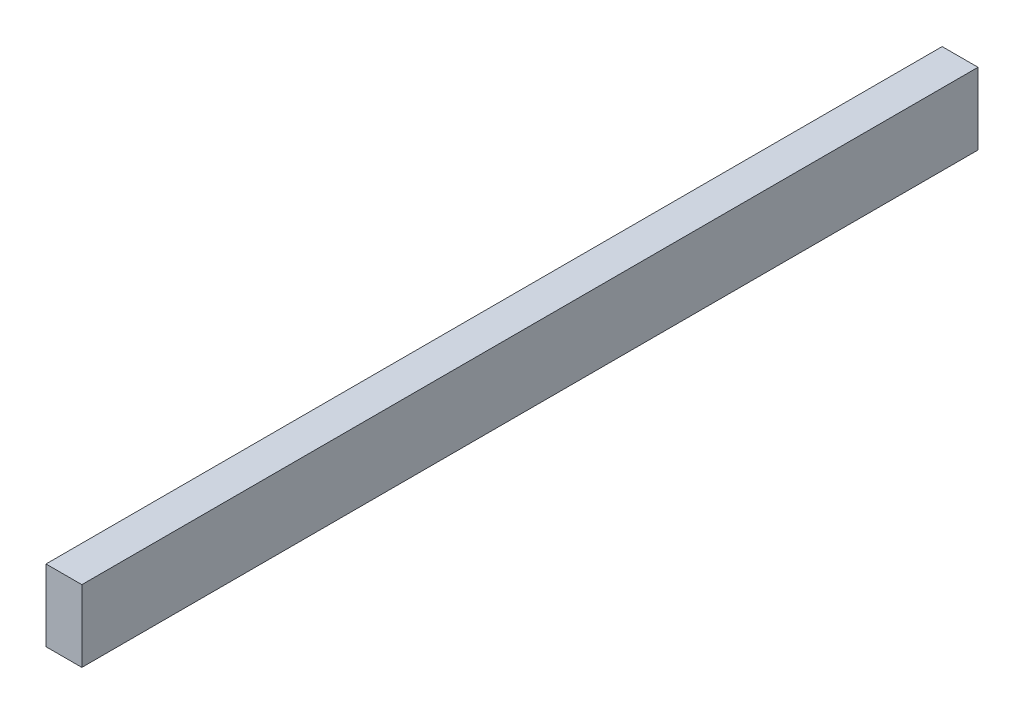
ISO-10303-21;
HEADER;
FILE_DESCRIPTION(('STEP AP214'),'2;1');
FILE_NAME('part.step','',(''),(''),'','','');
FILE_SCHEMA(('AUTOMOTIVE_DESIGN { 1 0 10303 214 1 1 1 1 }'));
ENDSEC;
DATA;
#1=APPLICATION_CONTEXT('core data for automotive mechanical design processes');
#2=APPLICATION_PROTOCOL_DEFINITION('international standard','automotive_design',2000,#1);
#3=PRODUCT_CONTEXT('',#1,'mechanical');
#4=PRODUCT('Part','Part','',(#3));
#5=PRODUCT_RELATED_PRODUCT_CATEGORY('part','',(#4));
#6=PRODUCT_DEFINITION_FORMATION('','',#4);
#7=PRODUCT_DEFINITION_CONTEXT('part definition',#1,'design');
#8=PRODUCT_DEFINITION('design','',#6,#7);
#9=PRODUCT_DEFINITION_SHAPE('','',#8);
#10=(LENGTH_UNIT() NAMED_UNIT(*) SI_UNIT(.MILLI.,.METRE.));
#11=(NAMED_UNIT(*) PLANE_ANGLE_UNIT() SI_UNIT($,.RADIAN.));
#12=(NAMED_UNIT(*) SI_UNIT($,.STERADIAN.) SOLID_ANGLE_UNIT());
#13=UNCERTAINTY_MEASURE_WITH_UNIT(LENGTH_MEASURE(1.E-05),#10,'distance_accuracy_value','');
#14=(GEOMETRIC_REPRESENTATION_CONTEXT(3) GLOBAL_UNCERTAINTY_ASSIGNED_CONTEXT((#13)) GLOBAL_UNIT_ASSIGNED_CONTEXT((#10,
#11,#12)) REPRESENTATION_CONTEXT('',''));
#15=CARTESIAN_POINT('',(0.,0.,0.));
#16=DIRECTION('',(0.,0.,1.));
#17=DIRECTION('',(1.,0.,0.));
#18=AXIS2_PLACEMENT_3D('',#15,#16,#17);
#19=CARTESIAN_POINT('',(-20.,-40.,1000.));
#20=DIRECTION('',(1.,0.,0.));
#21=DIRECTION('',(0.,0.,-1.));
#22=AXIS2_PLACEMENT_3D('',#19,#20,#21);
#23=PLANE('',#22);
#24=DIRECTION('',(0.,-1.,0.));
#25=VECTOR('',#24,1.);
#26=CARTESIAN_POINT('',(-20.,-40.,0.));
#27=LINE('',#26,#25);
#28=CARTESIAN_POINT('',(-20.,40.,0.));
#29=VERTEX_POINT('',#28);
#30=CARTESIAN_POINT('',(-20.,-40.,0.));
#31=VERTEX_POINT('',#30);
#32=EDGE_CURVE('E107',#29,#31,#27,.T.);
#33=ORIENTED_EDGE('',*,*,#32,.T.);
#34=DIRECTION('',(0.,0.,-1.));
#35=VECTOR('',#34,1.);
#36=CARTESIAN_POINT('',(-20.,-40.,1000.));
#37=LINE('',#36,#35);
#38=CARTESIAN_POINT('',(-20.,-40.,1000.));
#39=VERTEX_POINT('',#38);
#40=EDGE_CURVE('E11',#39,#31,#37,.T.);
#41=ORIENTED_EDGE('',*,*,#40,.F.);
#42=DIRECTION('',(0.,-1.,0.));
#43=VECTOR('',#42,1.);
#44=CARTESIAN_POINT('',(-20.,-40.,1000.));
#45=LINE('',#44,#43);
#46=CARTESIAN_POINT('',(-20.,40.,1000.));
#47=VERTEX_POINT('',#46);
#48=EDGE_CURVE('E91',#47,#39,#45,.T.);
#49=ORIENTED_EDGE('',*,*,#48,.F.);
#50=DIRECTION('',(0.,0.,-1.));
#51=VECTOR('',#50,1.);
#52=CARTESIAN_POINT('',(-20.,40.,1000.));
#53=LINE('',#52,#51);
#54=EDGE_CURVE('E103',#47,#29,#53,.T.);
#55=ORIENTED_EDGE('',*,*,#54,.T.);
#56=EDGE_LOOP('',(#33,#41,#49,#55));
#57=FACE_BOUND('',#56,.T.);
#58=ADVANCED_FACE('F39',(#57),#23,.F.);
#59=CARTESIAN_POINT('',(20.,-40.,1000.));
#60=DIRECTION('',(0.,1.,0.));
#61=DIRECTION('',(-1.,0.,0.));
#62=AXIS2_PLACEMENT_3D('',#59,#60,#61);
#63=PLANE('',#62);
#64=DIRECTION('',(1.,0.,0.));
#65=VECTOR('',#64,1.);
#66=CARTESIAN_POINT('',(20.,-40.,0.));
#67=LINE('',#66,#65);
#68=CARTESIAN_POINT('',(20.,-40.,0.));
#69=VERTEX_POINT('',#68);
#70=EDGE_CURVE('E96',#31,#69,#67,.T.);
#71=ORIENTED_EDGE('',*,*,#70,.T.);
#72=DIRECTION('',(0.,0.,-1.));
#73=VECTOR('',#72,1.);
#74=CARTESIAN_POINT('',(20.,-40.,1000.));
#75=LINE('',#74,#73);
#76=CARTESIAN_POINT('',(20.,-40.,1000.));
#77=VERTEX_POINT('',#76);
#78=EDGE_CURVE('E48',#77,#69,#75,.T.);
#79=ORIENTED_EDGE('',*,*,#78,.F.);
#80=DIRECTION('',(1.,0.,0.));
#81=VECTOR('',#80,1.);
#82=CARTESIAN_POINT('',(20.,-40.,1000.));
#83=LINE('',#82,#81);
#84=EDGE_CURVE('E86',#39,#77,#83,.T.);
#85=ORIENTED_EDGE('',*,*,#84,.F.);
#86=ORIENTED_EDGE('',*,*,#40,.T.);
#87=EDGE_LOOP('',(#71,#79,#85,#86));
#88=FACE_BOUND('',#87,.T.);
#89=ADVANCED_FACE('F95',(#88),#63,.F.);
#90=CARTESIAN_POINT('',(20.,-40.,1000.));
#91=DIRECTION('',(-1.,0.,0.));
#92=DIRECTION('',(0.,0.,1.));
#93=AXIS2_PLACEMENT_3D('',#90,#91,#92);
#94=PLANE('',#93);
#95=DIRECTION('',(0.,1.,0.));
#96=VECTOR('',#95,1.);
#97=CARTESIAN_POINT('',(20.,-40.,0.));
#98=LINE('',#97,#96);
#99=CARTESIAN_POINT('',(20.,40.,0.));
#100=VERTEX_POINT('',#99);
#101=EDGE_CURVE('E73',#69,#100,#98,.T.);
#102=ORIENTED_EDGE('',*,*,#101,.T.);
#103=DIRECTION('',(0.,0.,-1.));
#104=VECTOR('',#103,1.);
#105=CARTESIAN_POINT('',(20.,40.,1000.));
#106=LINE('',#105,#104);
#107=CARTESIAN_POINT('',(20.,40.,1000.));
#108=VERTEX_POINT('',#107);
#109=EDGE_CURVE('E98',#108,#100,#106,.T.);
#110=ORIENTED_EDGE('',*,*,#109,.F.);
#111=DIRECTION('',(0.,1.,0.));
#112=VECTOR('',#111,1.);
#113=CARTESIAN_POINT('',(20.,-40.,1000.));
#114=LINE('',#113,#112);
#115=EDGE_CURVE('E89',#77,#108,#114,.T.);
#116=ORIENTED_EDGE('',*,*,#115,.F.);
#117=ORIENTED_EDGE('',*,*,#78,.T.);
#118=EDGE_LOOP('',(#102,#110,#116,#117));
#119=FACE_BOUND('',#118,.T.);
#120=ADVANCED_FACE('F99',(#119),#94,.F.);
#121=CARTESIAN_POINT('',(20.,40.,1000.));
#122=DIRECTION('',(0.,-1.,0.));
#123=DIRECTION('',(0.,0.,-1.));
#124=AXIS2_PLACEMENT_3D('',#121,#122,#123);
#125=PLANE('',#124);
#126=DIRECTION('',(-1.,0.,0.));
#127=VECTOR('',#126,1.);
#128=CARTESIAN_POINT('',(20.,40.,0.));
#129=LINE('',#128,#127);
#130=EDGE_CURVE('E79',#100,#29,#129,.T.);
#131=ORIENTED_EDGE('',*,*,#130,.T.);
#132=ORIENTED_EDGE('',*,*,#54,.F.);
#133=DIRECTION('',(-1.,0.,0.));
#134=VECTOR('',#133,1.);
#135=CARTESIAN_POINT('',(20.,40.,1000.));
#136=LINE('',#135,#134);
#137=EDGE_CURVE('E56',#108,#47,#136,.T.);
#138=ORIENTED_EDGE('',*,*,#137,.F.);
#139=ORIENTED_EDGE('',*,*,#109,.T.);
#140=EDGE_LOOP('',(#131,#132,#138,#139));
#141=FACE_BOUND('',#140,.T.);
#142=ADVANCED_FACE('F120',(#141),#125,.F.);
#143=CARTESIAN_POINT('',(0.,0.,1000.));
#144=DIRECTION('',(0.,0.,1.));
#145=DIRECTION('',(1.,0.,0.));
#146=AXIS2_PLACEMENT_3D('',#143,#144,#145);
#147=PLANE('',#146);
#148=ORIENTED_EDGE('',*,*,#48,.T.);
#149=ORIENTED_EDGE('',*,*,#84,.T.);
#150=ORIENTED_EDGE('',*,*,#115,.T.);
#151=ORIENTED_EDGE('',*,*,#137,.T.);
#152=EDGE_LOOP('',(#148,#149,#150,#151));
#153=FACE_BOUND('',#152,.T.);
#154=ADVANCED_FACE('F87',(#153),#147,.T.);
#155=CARTESIAN_POINT('',(0.,0.,0.));
#156=DIRECTION('',(0.,0.,1.));
#157=DIRECTION('',(1.,0.,0.));
#158=AXIS2_PLACEMENT_3D('',#155,#156,#157);
#159=PLANE('',#158);
#160=ORIENTED_EDGE('',*,*,#32,.F.);
#161=ORIENTED_EDGE('',*,*,#130,.F.);
#162=ORIENTED_EDGE('',*,*,#101,.F.);
#163=ORIENTED_EDGE('',*,*,#70,.F.);
#164=EDGE_LOOP('',(#160,#161,#162,#163));
#165=FACE_BOUND('',#164,.T.);
#166=ADVANCED_FACE('F123',(#165),#159,.F.);
#167=CLOSED_SHELL('',(#58,#89,#120,#142,#154,#166));
#168=MANIFOLD_SOLID_BREP('B2',#167);
#169=ADVANCED_BREP_SHAPE_REPRESENTATION('',(#18,#168),#14);
#170=SHAPE_DEFINITION_REPRESENTATION(#9,#169);
ENDSEC;
END-ISO-10303-21;
